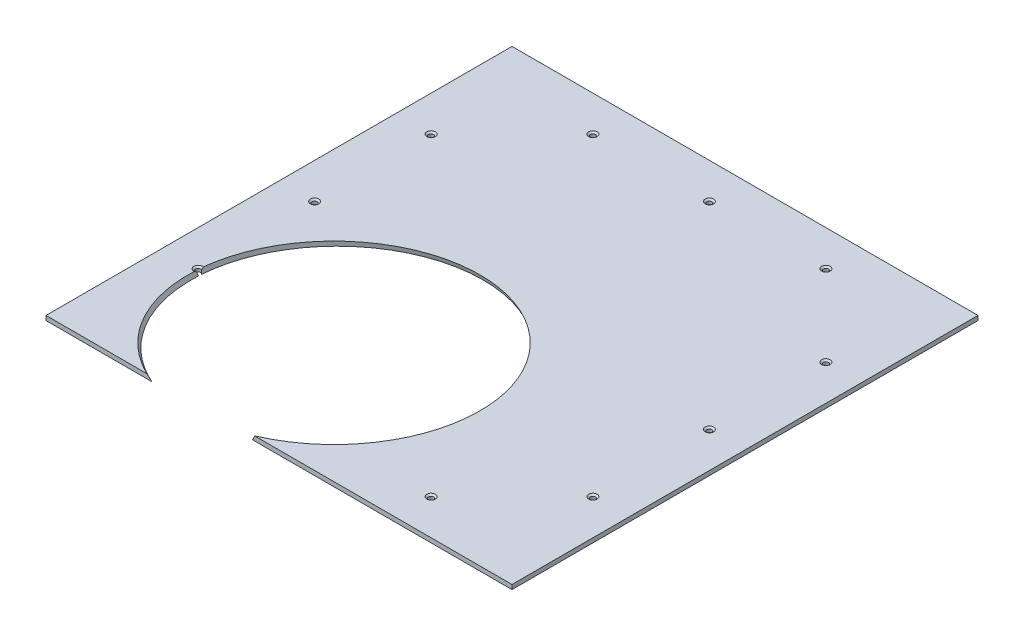
ISO-10303-21;
HEADER;
FILE_DESCRIPTION(('STEP AP214'),'2;1');
FILE_NAME('part.step','',(''),(''),'','','');
FILE_SCHEMA(('AUTOMOTIVE_DESIGN { 1 0 10303 214 1 1 1 1 }'));
ENDSEC;
DATA;
#1=APPLICATION_CONTEXT('core data for automotive mechanical design processes');
#2=APPLICATION_PROTOCOL_DEFINITION('international standard','automotive_design',2000,#1);
#3=PRODUCT_CONTEXT('',#1,'mechanical');
#4=PRODUCT('Part','Part','',(#3));
#5=PRODUCT_RELATED_PRODUCT_CATEGORY('part','',(#4));
#6=PRODUCT_DEFINITION_FORMATION('','',#4);
#7=PRODUCT_DEFINITION_CONTEXT('part definition',#1,'design');
#8=PRODUCT_DEFINITION('design','',#6,#7);
#9=PRODUCT_DEFINITION_SHAPE('','',#8);
#10=(LENGTH_UNIT() NAMED_UNIT(*) SI_UNIT(.MILLI.,.METRE.));
#11=(NAMED_UNIT(*) PLANE_ANGLE_UNIT() SI_UNIT($,.RADIAN.));
#12=(NAMED_UNIT(*) SI_UNIT($,.STERADIAN.) SOLID_ANGLE_UNIT());
#13=UNCERTAINTY_MEASURE_WITH_UNIT(LENGTH_MEASURE(1.E-05),#10,'distance_accuracy_value','');
#14=(GEOMETRIC_REPRESENTATION_CONTEXT(3) GLOBAL_UNCERTAINTY_ASSIGNED_CONTEXT((#13)) GLOBAL_UNIT_ASSIGNED_CONTEXT((#10,
#11,#12)) REPRESENTATION_CONTEXT('',''));
#15=CARTESIAN_POINT('',(0.,0.,0.));
#16=DIRECTION('',(0.,0.,1.));
#17=DIRECTION('',(1.,0.,0.));
#18=AXIS2_PLACEMENT_3D('',#15,#16,#17);
#19=CARTESIAN_POINT('',(83.101307,94.213807,83.101307));
#20=DIRECTION('',(0.,0.,1.));
#21=DIRECTION('',(-1.,0.,0.));
#22=AXIS2_PLACEMENT_3D('',#19,#20,#21);
#23=PLANE('',#22);
#24=CARTESIAN_POINT('',(-66.007660680962,217.846089201799,83.101307));
#25=DIRECTION('',(0.,0.,1.));
#26=DIRECTION('',(-0.326618295539672,0.945156330465368,0.));
#27=AXIS2_PLACEMENT_3D('',#24,#25,#26);
#28=ELLIPSE('',#27,142.645185752416,44.45);
#29=CARTESIAN_POINT('',(-47.0825286941283,94.213807,83.101307));
#30=VERTEX_POINT('',#29);
#31=CARTESIAN_POINT('',(-45.3284884922629,92.626307,83.101307));
#32=VERTEX_POINT('',#31);
#33=EDGE_CURVE('E127',#30,#32,#28,.T.);
#34=ORIENTED_EDGE('',*,*,#33,.F.);
#35=DIRECTION('',(-1.,0.,0.));
#36=VECTOR('',#35,1.);
#37=CARTESIAN_POINT('',(83.101307,94.213807,83.101307));
#38=LINE('',#37,#36);
#39=CARTESIAN_POINT('',(-83.101307,94.213807,83.101307));
#40=VERTEX_POINT('',#39);
#41=EDGE_CURVE('E215',#30,#40,#38,.T.);
#42=ORIENTED_EDGE('',*,*,#41,.T.);
#43=DIRECTION('',(0.,-1.,0.));
#44=VECTOR('',#43,1.);
#45=CARTESIAN_POINT('',(-83.101307,94.213807,83.101307));
#46=LINE('',#45,#44);
#47=CARTESIAN_POINT('',(-83.101307,92.626307,83.101307));
#48=VERTEX_POINT('',#47);
#49=EDGE_CURVE('E241',#40,#48,#46,.T.);
#50=ORIENTED_EDGE('',*,*,#49,.T.);
#51=DIRECTION('',(-1.,0.,0.));
#52=VECTOR('',#51,1.);
#53=CARTESIAN_POINT('',(83.101307,92.626307,83.101307));
#54=LINE('',#53,#52);
#55=EDGE_CURVE('E229',#32,#48,#54,.T.);
#56=ORIENTED_EDGE('',*,*,#55,.F.);
#57=EDGE_LOOP('',(#34,#42,#50,#56));
#58=FACE_BOUND('',#57,.T.);
#59=ADVANCED_FACE('F32',(#58),#23,.T.);
#60=CARTESIAN_POINT('',(83.101307,94.213807,83.101307));
#61=DIRECTION('',(1.,0.,0.));
#62=DIRECTION('',(0.,0.,1.));
#63=AXIS2_PLACEMENT_3D('',#60,#61,#62);
#64=PLANE('',#63);
#65=DIRECTION('',(0.,0.,1.));
#66=VECTOR('',#65,1.);
#67=CARTESIAN_POINT('',(83.101307,92.626307,83.101307));
#68=LINE('',#67,#66);
#69=CARTESIAN_POINT('',(83.101307,92.626307,-83.101307));
#70=VERTEX_POINT('',#69);
#71=CARTESIAN_POINT('',(83.101307,92.626307,83.101307));
#72=VERTEX_POINT('',#71);
#73=EDGE_CURVE('E211',#70,#72,#68,.T.);
#74=ORIENTED_EDGE('',*,*,#73,.F.);
#75=DIRECTION('',(0.,-1.,0.));
#76=VECTOR('',#75,1.);
#77=CARTESIAN_POINT('',(83.101307,94.213807,-83.101307));
#78=LINE('',#77,#76);
#79=CARTESIAN_POINT('',(83.101307,94.213807,-83.101307));
#80=VERTEX_POINT('',#79);
#81=EDGE_CURVE('E112',#80,#70,#78,.T.);
#82=ORIENTED_EDGE('',*,*,#81,.F.);
#83=DIRECTION('',(0.,0.,1.));
#84=VECTOR('',#83,1.);
#85=CARTESIAN_POINT('',(83.101307,94.213807,83.101307));
#86=LINE('',#85,#84);
#87=CARTESIAN_POINT('',(83.101307,94.213807,83.101307));
#88=VERTEX_POINT('',#87);
#89=EDGE_CURVE('E212',#80,#88,#86,.T.);
#90=ORIENTED_EDGE('',*,*,#89,.T.);
#91=DIRECTION('',(0.,-1.,0.));
#92=VECTOR('',#91,1.);
#93=CARTESIAN_POINT('',(83.101307,94.213807,83.101307));
#94=LINE('',#93,#92);
#95=EDGE_CURVE('E226',#88,#72,#94,.T.);
#96=ORIENTED_EDGE('',*,*,#95,.T.);
#97=EDGE_LOOP('',(#74,#82,#90,#96));
#98=FACE_BOUND('',#97,.T.);
#99=ADVANCED_FACE('F34',(#98),#64,.T.);
#100=CARTESIAN_POINT('',(83.101307,94.213807,-83.101307));
#101=DIRECTION('',(0.,0.,-1.));
#102=DIRECTION('',(1.,0.,0.));
#103=AXIS2_PLACEMENT_3D('',#100,#101,#102);
#104=PLANE('',#103);
#105=DIRECTION('',(1.,0.,0.));
#106=VECTOR('',#105,1.);
#107=CARTESIAN_POINT('',(83.101307,92.626307,-83.101307));
#108=LINE('',#107,#106);
#109=CARTESIAN_POINT('',(-83.101307,92.626307,-83.101307));
#110=VERTEX_POINT('',#109);
#111=EDGE_CURVE('E216',#110,#70,#108,.T.);
#112=ORIENTED_EDGE('',*,*,#111,.F.);
#113=DIRECTION('',(0.,-1.,0.));
#114=VECTOR('',#113,1.);
#115=CARTESIAN_POINT('',(-83.101307,94.213807,-83.101307));
#116=LINE('',#115,#114);
#117=CARTESIAN_POINT('',(-83.101307,94.213807,-83.101307));
#118=VERTEX_POINT('',#117);
#119=EDGE_CURVE('E239',#118,#110,#116,.T.);
#120=ORIENTED_EDGE('',*,*,#119,.F.);
#121=DIRECTION('',(1.,0.,0.));
#122=VECTOR('',#121,1.);
#123=CARTESIAN_POINT('',(83.101307,94.213807,-83.101307));
#124=LINE('',#123,#122);
#125=EDGE_CURVE('E223',#118,#80,#124,.T.);
#126=ORIENTED_EDGE('',*,*,#125,.T.);
#127=ORIENTED_EDGE('',*,*,#81,.T.);
#128=EDGE_LOOP('',(#112,#120,#126,#127));
#129=FACE_BOUND('',#128,.T.);
#130=ADVANCED_FACE('F289',(#129),#104,.T.);
#131=CARTESIAN_POINT('',(-83.101307,94.213807,83.101307));
#132=DIRECTION('',(-1.,0.,0.));
#133=DIRECTION('',(0.,0.,-1.));
#134=AXIS2_PLACEMENT_3D('',#131,#132,#133);
#135=PLANE('',#134);
#136=DIRECTION('',(0.,0.,-1.));
#137=VECTOR('',#136,1.);
#138=CARTESIAN_POINT('',(-83.101307,92.626307,83.101307));
#139=LINE('',#138,#137);
#140=EDGE_CURVE('E233',#48,#110,#139,.T.);
#141=ORIENTED_EDGE('',*,*,#140,.F.);
#142=ORIENTED_EDGE('',*,*,#49,.F.);
#143=DIRECTION('',(0.,0.,-1.));
#144=VECTOR('',#143,1.);
#145=CARTESIAN_POINT('',(-83.101307,94.213807,83.101307));
#146=LINE('',#145,#144);
#147=EDGE_CURVE('E220',#40,#118,#146,.T.);
#148=ORIENTED_EDGE('',*,*,#147,.T.);
#149=ORIENTED_EDGE('',*,*,#119,.T.);
#150=EDGE_LOOP('',(#141,#142,#148,#149));
#151=FACE_BOUND('',#150,.T.);
#152=ADVANCED_FACE('F286',(#151),#135,.T.);
#153=CARTESIAN_POINT('',(-9.44166394168704,92.626307,83.101307));
#154=VERTEX_POINT('',#153);
#155=CARTESIAN_POINT('',(-8.6669155379461,94.213807,83.101307));
#156=VERTEX_POINT('',#155);
#157=EDGE_CURVE('E271',#154,#156,#28,.T.);
#158=ORIENTED_EDGE('',*,*,#157,.F.);
#159=EDGE_CURVE('E230',#72,#154,#54,.T.);
#160=ORIENTED_EDGE('',*,*,#159,.F.);
#161=ORIENTED_EDGE('',*,*,#95,.F.);
#162=EDGE_CURVE('E217',#88,#156,#38,.T.);
#163=ORIENTED_EDGE('',*,*,#162,.T.);
#164=EDGE_LOOP('',(#158,#160,#161,#163));
#165=FACE_BOUND('',#164,.T.);
#166=ADVANCED_FACE('F297',(#165),#23,.T.);
#167=CARTESIAN_POINT('',(83.101307,94.213807,-83.101307));
#168=DIRECTION('',(0.,1.,0.));
#169=DIRECTION('',(0.,0.,-1.));
#170=AXIS2_PLACEMENT_3D('',#167,#168,#169);
#171=PLANE('',#170);
#172=CARTESIAN_POINT('',(-23.2839715040096,94.213807,40.2046350415651));
#173=DIRECTION('',(0.,1.,0.));
#174=DIRECTION('',(-0.705676740389854,0.,0.708533935724147));
#175=AXIS2_PLACEMENT_3D('',#172,#173,#174);
#176=ELLIPSE('',#175,49.4935758743306,44.45);
#177=CARTESIAN_POINT('',(-70.030023915099,94.213807,40.0856700322202));
#178=VERTEX_POINT('',#177);
#179=EDGE_CURVE('E52',#156,#178,#176,.T.);
#180=ORIENTED_EDGE('',*,*,#179,.F.);
#181=ORIENTED_EDGE('',*,*,#162,.F.);
#182=ORIENTED_EDGE('',*,*,#89,.F.);
#183=ORIENTED_EDGE('',*,*,#125,.F.);
#184=ORIENTED_EDGE('',*,*,#147,.F.);
#185=ORIENTED_EDGE('',*,*,#41,.F.);
#186=CARTESIAN_POINT('',(-70.2620861199085,94.2138069999999,43.05552732745));
#187=VERTEX_POINT('',#186);
#188=EDGE_CURVE('E272',#187,#30,#176,.T.);
#189=ORIENTED_EDGE('',*,*,#188,.F.);
#190=CARTESIAN_POINT('',(-70.4013070000004,94.213807,41.5506534999993));
#191=DIRECTION('',(0.,1.,0.));
#192=DIRECTION('',(0.,0.,-1.));
#193=AXIS2_PLACEMENT_3D('',#190,#191,#192);
#194=CIRCLE('',#193,1.51130000000001);
#195=EDGE_CURVE('E123',#178,#187,#194,.T.);
#196=ORIENTED_EDGE('',*,*,#195,.F.);
#197=EDGE_LOOP('',(#180,#181,#182,#183,#184,#185,#189,#196));
#198=FACE_BOUND('',#197,.T.);
#199=CARTESIAN_POINT('',(-70.401307,94.213807,-7.26677097100821E-13));
#200=DIRECTION('',(0.,1.,0.));
#201=DIRECTION('',(0.,0.,-1.));
#202=AXIS2_PLACEMENT_3D('',#199,#200,#201);
#203=CIRCLE('',#202,1.51129999999999);
#204=CARTESIAN_POINT('',(-70.401307,94.213807,-1.51130000000072));
#205=VERTEX_POINT('',#204);
#206=EDGE_CURVE('E125',#205,#205,#203,.T.);
#207=ORIENTED_EDGE('',*,*,#206,.F.);
#208=EDGE_LOOP('',(#207));
#209=FACE_BOUND('',#208,.T.);
#210=CARTESIAN_POINT('',(-70.4013069999996,94.213807,-41.5506535000007));
#211=DIRECTION('',(0.,1.,0.));
#212=DIRECTION('',(0.,0.,-1.));
#213=AXIS2_PLACEMENT_3D('',#210,#211,#212);
#214=CIRCLE('',#213,1.51129999999999);
#215=CARTESIAN_POINT('',(-70.4013069999996,94.213807,-43.0619535000007));
#216=VERTEX_POINT('',#215);
#217=EDGE_CURVE('E139',#216,#216,#214,.T.);
#218=ORIENTED_EDGE('',*,*,#217,.F.);
#219=EDGE_LOOP('',(#218));
#220=FACE_BOUND('',#219,.T.);
#221=CARTESIAN_POINT('',(41.5506534999995,94.213807,70.4013070000003));
#222=DIRECTION('',(0.,1.,0.));
#223=DIRECTION('',(0.,0.,-1.));
#224=AXIS2_PLACEMENT_3D('',#221,#222,#223);
#225=CIRCLE('',#224,1.5113);
#226=CARTESIAN_POINT('',(41.5506534999995,94.213807,68.8900070000003));
#227=VERTEX_POINT('',#226);
#228=EDGE_CURVE('E148',#227,#227,#225,.T.);
#229=ORIENTED_EDGE('',*,*,#228,.F.);
#230=EDGE_LOOP('',(#229));
#231=FACE_BOUND('',#230,.T.);
#232=CARTESIAN_POINT('',(70.4013070000001,94.213807,-41.5506534999998));
#233=DIRECTION('',(0.,1.,0.));
#234=DIRECTION('',(0.,0.,-1.));
#235=AXIS2_PLACEMENT_3D('',#232,#233,#234);
#236=CIRCLE('',#235,1.51129999999999);
#237=CARTESIAN_POINT('',(70.4013070000001,94.213807,-43.0619534999998));
#238=VERTEX_POINT('',#237);
#239=EDGE_CURVE('E157',#238,#238,#236,.T.);
#240=ORIENTED_EDGE('',*,*,#239,.F.);
#241=EDGE_LOOP('',(#240));
#242=FACE_BOUND('',#241,.T.);
#243=CARTESIAN_POINT('',(70.401307,94.213807,2.35067113119114E-13));
#244=DIRECTION('',(0.,1.,0.));
#245=DIRECTION('',(0.,0.,-1.));
#246=AXIS2_PLACEMENT_3D('',#243,#244,#245);
#247=CIRCLE('',#246,1.51129999999999);
#248=CARTESIAN_POINT('',(70.401307,94.213807,-1.51129999999976));
#249=VERTEX_POINT('',#248);
#250=EDGE_CURVE('E166',#249,#249,#247,.T.);
#251=ORIENTED_EDGE('',*,*,#250,.F.);
#252=EDGE_LOOP('',(#251));
#253=FACE_BOUND('',#252,.T.);
#254=CARTESIAN_POINT('',(70.4013069999999,94.213807,41.5506535000003));
#255=DIRECTION('',(0.,1.,0.));
#256=DIRECTION('',(0.,0.,-1.));
#257=AXIS2_PLACEMENT_3D('',#254,#255,#256);
#258=CIRCLE('',#257,1.51130000000001);
#259=CARTESIAN_POINT('',(70.4013069999999,94.213807,40.0393535000002));
#260=VERTEX_POINT('',#259);
#261=EDGE_CURVE('E175',#260,#260,#258,.T.);
#262=ORIENTED_EDGE('',*,*,#261,.F.);
#263=EDGE_LOOP('',(#262));
#264=FACE_BOUND('',#263,.T.);
#265=CARTESIAN_POINT('',(-41.5506535,94.213807,-70.401307));
#266=DIRECTION('',(0.,1.,0.));
#267=DIRECTION('',(0.,0.,-1.));
#268=AXIS2_PLACEMENT_3D('',#265,#266,#267);
#269=CIRCLE('',#268,1.5113);
#270=CARTESIAN_POINT('',(-41.5506535,94.213807,-71.912607));
#271=VERTEX_POINT('',#270);
#272=EDGE_CURVE('E184',#271,#271,#269,.T.);
#273=ORIENTED_EDGE('',*,*,#272,.F.);
#274=EDGE_LOOP('',(#273));
#275=FACE_BOUND('',#274,.T.);
#276=CARTESIAN_POINT('',(0.,94.213807,-70.401307));
#277=DIRECTION('',(0.,1.,0.));
#278=DIRECTION('',(0.,0.,-1.));
#279=AXIS2_PLACEMENT_3D('',#276,#277,#278);
#280=CIRCLE('',#279,1.5113);
#281=CARTESIAN_POINT('',(0.,94.213807,-71.912607));
#282=VERTEX_POINT('',#281);
#283=EDGE_CURVE('E193',#282,#282,#280,.T.);
#284=ORIENTED_EDGE('',*,*,#283,.F.);
#285=EDGE_LOOP('',(#284));
#286=FACE_BOUND('',#285,.T.);
#287=CARTESIAN_POINT('',(41.5506535,94.213807,-70.401307));
#288=DIRECTION('',(0.,1.,0.));
#289=DIRECTION('',(0.,0.,-1.));
#290=AXIS2_PLACEMENT_3D('',#287,#288,#289);
#291=CIRCLE('',#290,1.5113);
#292=CARTESIAN_POINT('',(41.5506535,94.213807,-71.912607));
#293=VERTEX_POINT('',#292);
#294=EDGE_CURVE('E202',#293,#293,#291,.T.);
#295=ORIENTED_EDGE('',*,*,#294,.F.);
#296=EDGE_LOOP('',(#295));
#297=FACE_BOUND('',#296,.T.);
#298=ADVANCED_FACE('F300',(#198,#209,#220,#231,#242,#253,#264,#275,#286,#297),#171,.T.);
#299=CARTESIAN_POINT('',(83.101307,92.626307,-83.101307));
#300=DIRECTION('',(0.,1.,0.));
#301=DIRECTION('',(0.,0.,-1.));
#302=AXIS2_PLACEMENT_3D('',#299,#300,#301);
#303=PLANE('',#302);
#304=ORIENTED_EDGE('',*,*,#159,.T.);
#305=CARTESIAN_POINT('',(-22.7353780835816,92.626307,39.6538204361786));
#306=DIRECTION('',(0.,1.,0.));
#307=DIRECTION('',(-0.705676740389854,0.,0.708533935724147));
#308=AXIS2_PLACEMENT_3D('',#305,#306,#307);
#309=ELLIPSE('',#308,49.4935758743306,44.45);
#310=CARTESIAN_POINT('',(-69.6279212997942,92.626307,41.1122523609537));
#311=VERTEX_POINT('',#310);
#312=EDGE_CURVE('E120',#154,#311,#309,.T.);
#313=ORIENTED_EDGE('',*,*,#312,.T.);
#314=CARTESIAN_POINT('',(-70.4013070000004,92.626307,41.5506534999993));
#315=DIRECTION('',(0.,1.,0.));
#316=DIRECTION('',(0.,0.,-1.));
#317=AXIS2_PLACEMENT_3D('',#314,#315,#316);
#318=CIRCLE('',#317,0.889000000000001);
#319=CARTESIAN_POINT('',(-69.6921231555642,92.626307,42.0867311760787));
#320=VERTEX_POINT('',#319);
#321=EDGE_CURVE('E119',#311,#320,#318,.T.);
#322=ORIENTED_EDGE('',*,*,#321,.T.);
#323=EDGE_CURVE('E270',#320,#32,#309,.T.);
#324=ORIENTED_EDGE('',*,*,#323,.T.);
#325=ORIENTED_EDGE('',*,*,#55,.T.);
#326=ORIENTED_EDGE('',*,*,#140,.T.);
#327=ORIENTED_EDGE('',*,*,#111,.T.);
#328=ORIENTED_EDGE('',*,*,#73,.T.);
#329=EDGE_LOOP('',(#304,#313,#322,#324,#325,#326,#327,#328));
#330=FACE_BOUND('',#329,.T.);
#331=CARTESIAN_POINT('',(-70.401307,92.626307,-7.26677097100821E-13));
#332=DIRECTION('',(0.,1.,0.));
#333=DIRECTION('',(0.,0.,-1.));
#334=AXIS2_PLACEMENT_3D('',#331,#332,#333);
#335=CIRCLE('',#334,0.889000000000001);
#336=CARTESIAN_POINT('',(-70.401307,92.626307,-0.889000000000728));
#337=VERTEX_POINT('',#336);
#338=EDGE_CURVE('E136',#337,#337,#335,.T.);
#339=ORIENTED_EDGE('',*,*,#338,.T.);
#340=EDGE_LOOP('',(#339));
#341=FACE_BOUND('',#340,.T.);
#342=CARTESIAN_POINT('',(-70.4013069999996,92.626307,-41.5506535000007));
#343=DIRECTION('',(0.,1.,0.));
#344=DIRECTION('',(0.,0.,-1.));
#345=AXIS2_PLACEMENT_3D('',#342,#343,#344);
#346=CIRCLE('',#345,0.889000000000001);
#347=CARTESIAN_POINT('',(-70.4013069999996,92.626307,-42.4396535000007));
#348=VERTEX_POINT('',#347);
#349=EDGE_CURVE('E145',#348,#348,#346,.T.);
#350=ORIENTED_EDGE('',*,*,#349,.T.);
#351=EDGE_LOOP('',(#350));
#352=FACE_BOUND('',#351,.T.);
#353=CARTESIAN_POINT('',(41.5506534999995,92.626307,70.4013070000003));
#354=DIRECTION('',(0.,1.,0.));
#355=DIRECTION('',(0.,0.,-1.));
#356=AXIS2_PLACEMENT_3D('',#353,#354,#355);
#357=CIRCLE('',#356,0.889000000000001);
#358=CARTESIAN_POINT('',(41.5506534999995,92.626307,69.5123070000003));
#359=VERTEX_POINT('',#358);
#360=EDGE_CURVE('E154',#359,#359,#357,.T.);
#361=ORIENTED_EDGE('',*,*,#360,.T.);
#362=EDGE_LOOP('',(#361));
#363=FACE_BOUND('',#362,.T.);
#364=CARTESIAN_POINT('',(70.4013070000001,92.626307,-41.5506534999998));
#365=DIRECTION('',(0.,1.,0.));
#366=DIRECTION('',(0.,0.,-1.));
#367=AXIS2_PLACEMENT_3D('',#364,#365,#366);
#368=CIRCLE('',#367,0.889000000000001);
#369=CARTESIAN_POINT('',(70.4013070000001,92.626307,-42.4396534999998));
#370=VERTEX_POINT('',#369);
#371=EDGE_CURVE('E163',#370,#370,#368,.T.);
#372=ORIENTED_EDGE('',*,*,#371,.T.);
#373=EDGE_LOOP('',(#372));
#374=FACE_BOUND('',#373,.T.);
#375=CARTESIAN_POINT('',(70.401307,92.626307,2.35067113119114E-13));
#376=DIRECTION('',(0.,1.,0.));
#377=DIRECTION('',(0.,0.,-1.));
#378=AXIS2_PLACEMENT_3D('',#375,#376,#377);
#379=CIRCLE('',#378,0.889000000000001);
#380=CARTESIAN_POINT('',(70.401307,92.626307,-0.888999999999766));
#381=VERTEX_POINT('',#380);
#382=EDGE_CURVE('E172',#381,#381,#379,.T.);
#383=ORIENTED_EDGE('',*,*,#382,.T.);
#384=EDGE_LOOP('',(#383));
#385=FACE_BOUND('',#384,.T.);
#386=CARTESIAN_POINT('',(70.4013069999999,92.626307,41.5506535000003));
#387=DIRECTION('',(0.,1.,0.));
#388=DIRECTION('',(0.,0.,-1.));
#389=AXIS2_PLACEMENT_3D('',#386,#387,#388);
#390=CIRCLE('',#389,0.889000000000001);
#391=CARTESIAN_POINT('',(70.4013069999999,92.626307,40.6616535000002));
#392=VERTEX_POINT('',#391);
#393=EDGE_CURVE('E181',#392,#392,#390,.T.);
#394=ORIENTED_EDGE('',*,*,#393,.T.);
#395=EDGE_LOOP('',(#394));
#396=FACE_BOUND('',#395,.T.);
#397=CARTESIAN_POINT('',(-41.5506535,92.626307,-70.401307));
#398=DIRECTION('',(0.,1.,0.));
#399=DIRECTION('',(0.,0.,-1.));
#400=AXIS2_PLACEMENT_3D('',#397,#398,#399);
#401=CIRCLE('',#400,0.889000000000001);
#402=CARTESIAN_POINT('',(-41.5506535,92.626307,-71.290307));
#403=VERTEX_POINT('',#402);
#404=EDGE_CURVE('E190',#403,#403,#401,.T.);
#405=ORIENTED_EDGE('',*,*,#404,.T.);
#406=EDGE_LOOP('',(#405));
#407=FACE_BOUND('',#406,.T.);
#408=CARTESIAN_POINT('',(0.,92.626307,-70.401307));
#409=DIRECTION('',(0.,1.,0.));
#410=DIRECTION('',(0.,0.,-1.));
#411=AXIS2_PLACEMENT_3D('',#408,#409,#410);
#412=CIRCLE('',#411,0.889);
#413=CARTESIAN_POINT('',(0.,92.626307,-71.290307));
#414=VERTEX_POINT('',#413);
#415=EDGE_CURVE('E199',#414,#414,#412,.T.);
#416=ORIENTED_EDGE('',*,*,#415,.T.);
#417=EDGE_LOOP('',(#416));
#418=FACE_BOUND('',#417,.T.);
#419=CARTESIAN_POINT('',(41.5506535,92.626307,-70.401307));
#420=DIRECTION('',(0.,1.,0.));
#421=DIRECTION('',(0.,0.,-1.));
#422=AXIS2_PLACEMENT_3D('',#419,#420,#421);
#423=CIRCLE('',#422,0.889000000000001);
#424=CARTESIAN_POINT('',(41.5506535,92.626307,-71.290307));
#425=VERTEX_POINT('',#424);
#426=EDGE_CURVE('E208',#425,#425,#423,.T.);
#427=ORIENTED_EDGE('',*,*,#426,.T.);
#428=EDGE_LOOP('',(#427));
#429=FACE_BOUND('',#428,.T.);
#430=ADVANCED_FACE('F278',(#330,#341,#352,#363,#374,#385,#396,#407,#418,#429),#303,.F.);
#431=CARTESIAN_POINT('',(41.5506535,94.213807,-70.401307));
#432=DIRECTION('',(0.,1.,0.));
#433=DIRECTION('',(0.,0.,-1.));
#434=AXIS2_PLACEMENT_3D('',#431,#432,#433);
#435=CYLINDRICAL_SURFACE('',#434,0.888999999999997);
#436=ORIENTED_EDGE('',*,*,#426,.F.);
#437=EDGE_LOOP('',(#436));
#438=FACE_BOUND('',#437,.T.);
#439=CARTESIAN_POINT('',(41.5506535,93.6916352995184,-70.401307));
#440=DIRECTION('',(0.,1.,0.));
#441=DIRECTION('',(0.,0.,-1.));
#442=AXIS2_PLACEMENT_3D('',#439,#440,#441);
#443=CIRCLE('',#442,0.888999999999994);
#444=CARTESIAN_POINT('',(41.5506535,93.6916352995184,-71.290307));
#445=VERTEX_POINT('',#444);
#446=EDGE_CURVE('E205',#445,#445,#443,.T.);
#447=ORIENTED_EDGE('',*,*,#446,.T.);
#448=EDGE_LOOP('',(#447));
#449=FACE_BOUND('',#448,.T.);
#450=ADVANCED_FACE('F325',(#438,#449),#435,.F.);
#451=CARTESIAN_POINT('',(41.5506535,94.213807,-70.401307));
#452=DIRECTION('',(0.,1.,0.));
#453=DIRECTION('',(0.,0.,-1.));
#454=AXIS2_PLACEMENT_3D('',#451,#452,#453);
#455=CONICAL_SURFACE('',#454,1.5113,0.872664625997172);
#456=ORIENTED_EDGE('',*,*,#446,.F.);
#457=EDGE_LOOP('',(#456));
#458=FACE_BOUND('',#457,.T.);
#459=ORIENTED_EDGE('',*,*,#294,.T.);
#460=EDGE_LOOP('',(#459));
#461=FACE_BOUND('',#460,.T.);
#462=ADVANCED_FACE('F322',(#458,#461),#455,.F.);
#463=CARTESIAN_POINT('',(0.,94.213807,-70.401307));
#464=DIRECTION('',(0.,1.,0.));
#465=DIRECTION('',(0.,0.,-1.));
#466=AXIS2_PLACEMENT_3D('',#463,#464,#465);
#467=CYLINDRICAL_SURFACE('',#466,0.888999999999998);
#468=ORIENTED_EDGE('',*,*,#415,.F.);
#469=EDGE_LOOP('',(#468));
#470=FACE_BOUND('',#469,.T.);
#471=CARTESIAN_POINT('',(0.,93.6916352995184,-70.401307));
#472=DIRECTION('',(0.,1.,0.));
#473=DIRECTION('',(0.,0.,-1.));
#474=AXIS2_PLACEMENT_3D('',#471,#472,#473);
#475=CIRCLE('',#474,0.888999999999997);
#476=CARTESIAN_POINT('',(0.,93.6916352995184,-71.290307));
#477=VERTEX_POINT('',#476);
#478=EDGE_CURVE('E196',#477,#477,#475,.T.);
#479=ORIENTED_EDGE('',*,*,#478,.T.);
#480=EDGE_LOOP('',(#479));
#481=FACE_BOUND('',#480,.T.);
#482=ADVANCED_FACE('F324',(#470,#481),#467,.F.);
#483=CARTESIAN_POINT('',(0.,94.213807,-70.401307));
#484=DIRECTION('',(0.,1.,0.));
#485=DIRECTION('',(0.,0.,-1.));
#486=AXIS2_PLACEMENT_3D('',#483,#484,#485);
#487=CONICAL_SURFACE('',#486,1.5113,0.87266462599717);
#488=ORIENTED_EDGE('',*,*,#478,.F.);
#489=EDGE_LOOP('',(#488));
#490=FACE_BOUND('',#489,.T.);
#491=ORIENTED_EDGE('',*,*,#283,.T.);
#492=EDGE_LOOP('',(#491));
#493=FACE_BOUND('',#492,.T.);
#494=ADVANCED_FACE('F332',(#490,#493),#487,.F.);
#495=CARTESIAN_POINT('',(-41.5506535,94.213807,-70.401307));
#496=DIRECTION('',(0.,1.,0.));
#497=DIRECTION('',(0.,0.,-1.));
#498=AXIS2_PLACEMENT_3D('',#495,#496,#497);
#499=CYLINDRICAL_SURFACE('',#498,0.888999999999997);
#500=ORIENTED_EDGE('',*,*,#404,.F.);
#501=EDGE_LOOP('',(#500));
#502=FACE_BOUND('',#501,.T.);
#503=CARTESIAN_POINT('',(-41.5506535,93.6916352995184,-70.401307));
#504=DIRECTION('',(0.,1.,0.));
#505=DIRECTION('',(0.,0.,-1.));
#506=AXIS2_PLACEMENT_3D('',#503,#504,#505);
#507=CIRCLE('',#506,0.888999999999994);
#508=CARTESIAN_POINT('',(-41.5506535,93.6916352995184,-71.290307));
#509=VERTEX_POINT('',#508);
#510=EDGE_CURVE('E187',#509,#509,#507,.T.);
#511=ORIENTED_EDGE('',*,*,#510,.T.);
#512=EDGE_LOOP('',(#511));
#513=FACE_BOUND('',#512,.T.);
#514=ADVANCED_FACE('F384',(#502,#513),#499,.F.);
#515=CARTESIAN_POINT('',(-41.5506535,94.213807,-70.401307));
#516=DIRECTION('',(0.,1.,0.));
#517=DIRECTION('',(0.,0.,-1.));
#518=AXIS2_PLACEMENT_3D('',#515,#516,#517);
#519=CONICAL_SURFACE('',#518,1.5113,0.872664625997172);
#520=ORIENTED_EDGE('',*,*,#510,.F.);
#521=EDGE_LOOP('',(#520));
#522=FACE_BOUND('',#521,.T.);
#523=ORIENTED_EDGE('',*,*,#272,.T.);
#524=EDGE_LOOP('',(#523));
#525=FACE_BOUND('',#524,.T.);
#526=ADVANCED_FACE('F394',(#522,#525),#519,.F.);
#527=CARTESIAN_POINT('',(70.4013069999999,94.213807,41.5506535000003));
#528=DIRECTION('',(0.,1.,0.));
#529=DIRECTION('',(0.,0.,-1.));
#530=AXIS2_PLACEMENT_3D('',#527,#528,#529);
#531=CYLINDRICAL_SURFACE('',#530,0.889000000000001);
#532=ORIENTED_EDGE('',*,*,#393,.F.);
#533=EDGE_LOOP('',(#532));
#534=FACE_BOUND('',#533,.T.);
#535=CARTESIAN_POINT('',(70.4013069999999,93.6916352995184,41.5506535000003));
#536=DIRECTION('',(0.,1.,0.));
#537=DIRECTION('',(0.,0.,-1.));
#538=AXIS2_PLACEMENT_3D('',#535,#536,#537);
#539=CIRCLE('',#538,0.889000000000001);
#540=CARTESIAN_POINT('',(70.4013069999999,93.6916352995184,40.6616535000002));
#541=VERTEX_POINT('',#540);
#542=EDGE_CURVE('E178',#541,#541,#539,.T.);
#543=ORIENTED_EDGE('',*,*,#542,.T.);
#544=EDGE_LOOP('',(#543));
#545=FACE_BOUND('',#544,.T.);
#546=ADVANCED_FACE('F404',(#534,#545),#531,.F.);
#547=CARTESIAN_POINT('',(70.4013069999999,94.213807,41.5506535000003));
#548=DIRECTION('',(0.,1.,0.));
#549=DIRECTION('',(0.,0.,-1.));
#550=AXIS2_PLACEMENT_3D('',#547,#548,#549);
#551=CONICAL_SURFACE('',#550,1.51130000000001,0.872664625997172);
#552=ORIENTED_EDGE('',*,*,#542,.F.);
#553=EDGE_LOOP('',(#552));
#554=FACE_BOUND('',#553,.T.);
#555=ORIENTED_EDGE('',*,*,#261,.T.);
#556=EDGE_LOOP('',(#555));
#557=FACE_BOUND('',#556,.T.);
#558=ADVANCED_FACE('F414',(#554,#557),#551,.F.);
#559=CARTESIAN_POINT('',(70.401307,94.213807,2.35067113119114E-13));
#560=DIRECTION('',(0.,1.,0.));
#561=DIRECTION('',(0.,0.,-1.));
#562=AXIS2_PLACEMENT_3D('',#559,#560,#561);
#563=CYLINDRICAL_SURFACE('',#562,0.889000000000001);
#564=ORIENTED_EDGE('',*,*,#382,.F.);
#565=EDGE_LOOP('',(#564));
#566=FACE_BOUND('',#565,.T.);
#567=CARTESIAN_POINT('',(70.401307,93.6916352995184,2.35067113119114E-13));
#568=DIRECTION('',(0.,1.,0.));
#569=DIRECTION('',(0.,0.,-1.));
#570=AXIS2_PLACEMENT_3D('',#567,#568,#569);
#571=CIRCLE('',#570,0.889000000000001);
#572=CARTESIAN_POINT('',(70.401307,93.6916352995184,-0.888999999999766));
#573=VERTEX_POINT('',#572);
#574=EDGE_CURVE('E169',#573,#573,#571,.T.);
#575=ORIENTED_EDGE('',*,*,#574,.T.);
#576=EDGE_LOOP('',(#575));
#577=FACE_BOUND('',#576,.T.);
#578=ADVANCED_FACE('F424',(#566,#577),#563,.F.);
#579=CARTESIAN_POINT('',(70.401307,94.213807,2.35067113119114E-13));
#580=DIRECTION('',(0.,1.,0.));
#581=DIRECTION('',(0.,0.,-1.));
#582=AXIS2_PLACEMENT_3D('',#579,#580,#581);
#583=CONICAL_SURFACE('',#582,1.51129999999999,0.872664625997161);
#584=ORIENTED_EDGE('',*,*,#574,.F.);
#585=EDGE_LOOP('',(#584));
#586=FACE_BOUND('',#585,.T.);
#587=ORIENTED_EDGE('',*,*,#250,.T.);
#588=EDGE_LOOP('',(#587));
#589=FACE_BOUND('',#588,.T.);
#590=ADVANCED_FACE('F434',(#586,#589),#583,.F.);
#591=CARTESIAN_POINT('',(70.4013070000001,94.213807,-41.5506534999998));
#592=DIRECTION('',(0.,1.,0.));
#593=DIRECTION('',(0.,0.,-1.));
#594=AXIS2_PLACEMENT_3D('',#591,#592,#593);
#595=CYLINDRICAL_SURFACE('',#594,0.889000000000001);
#596=ORIENTED_EDGE('',*,*,#371,.F.);
#597=EDGE_LOOP('',(#596));
#598=FACE_BOUND('',#597,.T.);
#599=CARTESIAN_POINT('',(70.4013070000001,93.6916352995184,-41.5506534999998));
#600=DIRECTION('',(0.,1.,0.));
#601=DIRECTION('',(0.,0.,-1.));
#602=AXIS2_PLACEMENT_3D('',#599,#600,#601);
#603=CIRCLE('',#602,0.889000000000001);
#604=CARTESIAN_POINT('',(70.4013070000001,93.6916352995184,-42.4396534999998));
#605=VERTEX_POINT('',#604);
#606=EDGE_CURVE('E160',#605,#605,#603,.T.);
#607=ORIENTED_EDGE('',*,*,#606,.T.);
#608=EDGE_LOOP('',(#607));
#609=FACE_BOUND('',#608,.T.);
#610=ADVANCED_FACE('F444',(#598,#609),#595,.F.);
#611=CARTESIAN_POINT('',(70.4013070000001,94.213807,-41.5506534999998));
#612=DIRECTION('',(0.,1.,0.));
#613=DIRECTION('',(0.,0.,-1.));
#614=AXIS2_PLACEMENT_3D('',#611,#612,#613);
#615=CONICAL_SURFACE('',#614,1.51129999999999,0.872664625997161);
#616=ORIENTED_EDGE('',*,*,#606,.F.);
#617=EDGE_LOOP('',(#616));
#618=FACE_BOUND('',#617,.T.);
#619=ORIENTED_EDGE('',*,*,#239,.T.);
#620=EDGE_LOOP('',(#619));
#621=FACE_BOUND('',#620,.T.);
#622=ADVANCED_FACE('F454',(#618,#621),#615,.F.);
#623=CARTESIAN_POINT('',(41.5506534999995,94.213807,70.4013070000003));
#624=DIRECTION('',(0.,1.,0.));
#625=DIRECTION('',(0.,0.,-1.));
#626=AXIS2_PLACEMENT_3D('',#623,#624,#625);
#627=CYLINDRICAL_SURFACE('',#626,0.888999999999997);
#628=ORIENTED_EDGE('',*,*,#360,.F.);
#629=EDGE_LOOP('',(#628));
#630=FACE_BOUND('',#629,.T.);
#631=CARTESIAN_POINT('',(41.5506534999995,93.6916352995184,70.4013070000003));
#632=DIRECTION('',(0.,1.,0.));
#633=DIRECTION('',(0.,0.,-1.));
#634=AXIS2_PLACEMENT_3D('',#631,#632,#633);
#635=CIRCLE('',#634,0.888999999999994);
#636=CARTESIAN_POINT('',(41.5506534999995,93.6916352995184,69.5123070000003));
#637=VERTEX_POINT('',#636);
#638=EDGE_CURVE('E151',#637,#637,#635,.T.);
#639=ORIENTED_EDGE('',*,*,#638,.T.);
#640=EDGE_LOOP('',(#639));
#641=FACE_BOUND('',#640,.T.);
#642=ADVANCED_FACE('F464',(#630,#641),#627,.F.);
#643=CARTESIAN_POINT('',(41.5506534999995,94.213807,70.4013070000003));
#644=DIRECTION('',(0.,1.,0.));
#645=DIRECTION('',(0.,0.,-1.));
#646=AXIS2_PLACEMENT_3D('',#643,#644,#645);
#647=CONICAL_SURFACE('',#646,1.5113,0.872664625997172);
#648=ORIENTED_EDGE('',*,*,#638,.F.);
#649=EDGE_LOOP('',(#648));
#650=FACE_BOUND('',#649,.T.);
#651=ORIENTED_EDGE('',*,*,#228,.T.);
#652=EDGE_LOOP('',(#651));
#653=FACE_BOUND('',#652,.T.);
#654=ADVANCED_FACE('F474',(#650,#653),#647,.F.);
#655=CARTESIAN_POINT('',(-70.4013069999996,94.213807,-41.5506535000007));
#656=DIRECTION('',(0.,1.,0.));
#657=DIRECTION('',(0.,0.,-1.));
#658=AXIS2_PLACEMENT_3D('',#655,#656,#657);
#659=CYLINDRICAL_SURFACE('',#658,0.889000000000001);
#660=ORIENTED_EDGE('',*,*,#349,.F.);
#661=EDGE_LOOP('',(#660));
#662=FACE_BOUND('',#661,.T.);
#663=CARTESIAN_POINT('',(-70.4013069999996,93.6916352995184,-41.5506535000007));
#664=DIRECTION('',(0.,1.,0.));
#665=DIRECTION('',(0.,0.,-1.));
#666=AXIS2_PLACEMENT_3D('',#663,#664,#665);
#667=CIRCLE('',#666,0.889000000000001);
#668=CARTESIAN_POINT('',(-70.4013069999996,93.6916352995184,-42.4396535000007));
#669=VERTEX_POINT('',#668);
#670=EDGE_CURVE('E142',#669,#669,#667,.T.);
#671=ORIENTED_EDGE('',*,*,#670,.T.);
#672=EDGE_LOOP('',(#671));
#673=FACE_BOUND('',#672,.T.);
#674=ADVANCED_FACE('F484',(#662,#673),#659,.F.);
#675=CARTESIAN_POINT('',(-70.4013069999996,94.213807,-41.5506535000007));
#676=DIRECTION('',(0.,1.,0.));
#677=DIRECTION('',(0.,0.,-1.));
#678=AXIS2_PLACEMENT_3D('',#675,#676,#677);
#679=CONICAL_SURFACE('',#678,1.51129999999999,0.872664625997161);
#680=ORIENTED_EDGE('',*,*,#670,.F.);
#681=EDGE_LOOP('',(#680));
#682=FACE_BOUND('',#681,.T.);
#683=ORIENTED_EDGE('',*,*,#217,.T.);
#684=EDGE_LOOP('',(#683));
#685=FACE_BOUND('',#684,.T.);
#686=ADVANCED_FACE('F494',(#682,#685),#679,.F.);
#687=CARTESIAN_POINT('',(-70.401307,94.213807,-7.26677097100821E-13));
#688=DIRECTION('',(0.,1.,0.));
#689=DIRECTION('',(0.,0.,-1.));
#690=AXIS2_PLACEMENT_3D('',#687,#688,#689);
#691=CYLINDRICAL_SURFACE('',#690,0.889000000000001);
#692=ORIENTED_EDGE('',*,*,#338,.F.);
#693=EDGE_LOOP('',(#692));
#694=FACE_BOUND('',#693,.T.);
#695=CARTESIAN_POINT('',(-70.401307,93.6916352995184,-7.26677097100821E-13));
#696=DIRECTION('',(0.,1.,0.));
#697=DIRECTION('',(0.,0.,-1.));
#698=AXIS2_PLACEMENT_3D('',#695,#696,#697);
#699=CIRCLE('',#698,0.889000000000001);
#700=CARTESIAN_POINT('',(-70.401307,93.6916352995184,-0.889000000000728));
#701=VERTEX_POINT('',#700);
#702=EDGE_CURVE('E133',#701,#701,#699,.T.);
#703=ORIENTED_EDGE('',*,*,#702,.T.);
#704=EDGE_LOOP('',(#703));
#705=FACE_BOUND('',#704,.T.);
#706=ADVANCED_FACE('F504',(#694,#705),#691,.F.);
#707=CARTESIAN_POINT('',(-70.401307,94.213807,-7.26677097100821E-13));
#708=DIRECTION('',(0.,1.,0.));
#709=DIRECTION('',(0.,0.,-1.));
#710=AXIS2_PLACEMENT_3D('',#707,#708,#709);
#711=CONICAL_SURFACE('',#710,1.51129999999999,0.872664625997161);
#712=ORIENTED_EDGE('',*,*,#702,.F.);
#713=EDGE_LOOP('',(#712));
#714=FACE_BOUND('',#713,.T.);
#715=ORIENTED_EDGE('',*,*,#206,.T.);
#716=EDGE_LOOP('',(#715));
#717=FACE_BOUND('',#716,.T.);
#718=ADVANCED_FACE('F263',(#714,#717),#711,.F.);
#719=CARTESIAN_POINT('',(-70.4013070000004,94.213807,41.5506534999993));
#720=DIRECTION('',(0.,1.,0.));
#721=DIRECTION('',(0.,0.,-1.));
#722=AXIS2_PLACEMENT_3D('',#719,#720,#721);
#723=CYLINDRICAL_SURFACE('',#722,0.889000000000001);
#724=ORIENTED_EDGE('',*,*,#321,.F.);
#725=CARTESIAN_POINT('',(-69.6279212997942,92.626307,41.1122523609537));
#726=CARTESIAN_POINT('',(-69.6397645588022,92.6683951856804,41.091415084148));
#727=CARTESIAN_POINT('',(-69.6518631923127,92.7110690301723,41.0719815523858));
#728=CARTESIAN_POINT('',(-69.6764476061919,92.7972694421581,41.0354874081248));
#729=CARTESIAN_POINT('',(-69.6889330449399,92.8407952453701,41.0184247708584));
#730=CARTESIAN_POINT('',(-69.7141365393534,92.9282749368689,40.9862695040793));
#731=CARTESIAN_POINT('',(-69.7268534341198,92.9722263446889,40.9711690991713));
#732=CARTESIAN_POINT('',(-69.7525117742733,93.060594545975,40.9425787904913));
#733=CARTESIAN_POINT('',(-69.7654532744142,93.1050114518435,40.9290892859213));
#734=CARTESIAN_POINT('',(-69.8045204075196,93.238707469368,40.8907267537419));
#735=CARTESIAN_POINT('',(-69.830910997639,93.3285091837785,40.8679322835095));
#736=CARTESIAN_POINT('',(-69.8709131701333,93.4640270890091,40.8370106955062));
#737=CARTESIAN_POINT('',(-69.8843460999019,93.509434656864,40.8272309440469));
#738=CARTESIAN_POINT('',(-69.9113159000503,93.6004155636494,40.8086984012222));
#739=CARTESIAN_POINT('',(-69.9248527433388,93.6459888578448,40.7999453512663));
#740=CARTESIAN_POINT('',(-69.9384366638228,93.6916352995168,40.7916593946949));
#741=B_SPLINE_CURVE_WITH_KNOTS('',3,(#725,#726,#727,#728,#729,#730,#731,#732,#733,#734,#735,
#736,#737,#738,#739,#740),.UNSPECIFIED.,.F.,.F.,(4,2,2,2,2,2,2,4),(0.,0.14523099797408,
0.290337194744758,0.434849630566928,0.579397804459532,0.8682395812033,1.01328892950658,
1.15830166611951),.UNSPECIFIED.);
#742=CARTESIAN_POINT('',(-69.9384366638231,93.6916352995173,40.7916593946962));
#743=VERTEX_POINT('',#742);
#744=EDGE_CURVE('E106',#311,#743,#741,.T.);
#745=ORIENTED_EDGE('',*,*,#744,.T.);
#746=CARTESIAN_POINT('',(-70.4013070000004,93.6916352995184,41.5506534999993));
#747=DIRECTION('',(0.,1.,0.));
#748=DIRECTION('',(0.,0.,-1.));
#749=AXIS2_PLACEMENT_3D('',#746,#747,#748);
#750=CIRCLE('',#749,0.889000000000001);
#751=CARTESIAN_POINT('',(-70.0553677867465,93.6916352995184,42.3695839370532));
#752=VERTEX_POINT('',#751);
#753=EDGE_CURVE('E117',#743,#752,#750,.T.);
#754=ORIENTED_EDGE('',*,*,#753,.T.);
#755=CARTESIAN_POINT('',(-70.0553677867465,93.6916352995184,42.3695839370532));
#756=CARTESIAN_POINT('',(-70.0401224181644,93.6459561976716,42.3631421193864));
#757=CARTESIAN_POINT('',(-70.0248701016371,93.600352592311,42.3561999311237));
#758=CARTESIAN_POINT('',(-69.9943544414338,93.5093156406947,42.3412226536581));
#759=CARTESIAN_POINT('',(-69.9790910959136,93.4638823423054,42.3331872778737));
#760=CARTESIAN_POINT('',(-69.9334413079929,93.328319898055,42.3073878768447));
#761=CARTESIAN_POINT('',(-69.9030546544449,93.2385071619466,42.2878728948845));
#762=CARTESIAN_POINT('',(-69.8575646268038,93.1048189689402,42.254229288269));
#763=CARTESIAN_POINT('',(-69.8424094851779,93.0604083282925,42.2422798757477));
#764=CARTESIAN_POINT('',(-69.8121606786104,92.9720617962261,42.2167013689745));
#765=CARTESIAN_POINT('',(-69.7970669993376,92.9281257896571,42.2030726925546));
#766=CARTESIAN_POINT('',(-69.7669059122425,92.8406763768294,42.1737939092221));
#767=CARTESIAN_POINT('',(-69.7518389070517,92.7971656542477,42.1581352339431));
#768=CARTESIAN_POINT('',(-69.7218512010208,92.7110076049184,42.124376772863));
#769=CARTESIAN_POINT('',(-69.7069306378494,92.6683610567036,42.1062748894303));
#770=CARTESIAN_POINT('',(-69.6921231555601,92.6263070000022,42.0867311760732));
#771=B_SPLINE_CURVE_WITH_KNOTS('',3,(#755,#756,#757,#758,#759,#760,#761,#762,#763,#764,#765,
#766,#767,#768,#769,#770),.UNSPECIFIED.,.F.,.F.,(4,2,2,2,2,2,2,4),(0.,0.145746143780898,
0.291530569127369,0.581757830898506,0.727002079977663,0.872210262306525,1.01805262126343,
1.16402100017537),.UNSPECIFIED.);
#772=EDGE_CURVE('E60',#752,#320,#771,.T.);
#773=ORIENTED_EDGE('',*,*,#772,.T.);
#774=EDGE_LOOP('',(#724,#745,#754,#773));
#775=FACE_BOUND('',#774,.T.);
#776=ADVANCED_FACE('F116',(#775),#723,.F.);
#777=CARTESIAN_POINT('',(-70.4013070000004,94.213807,41.5506534999993));
#778=DIRECTION('',(0.,1.,0.));
#779=DIRECTION('',(0.,0.,-1.));
#780=AXIS2_PLACEMENT_3D('',#777,#778,#779);
#781=CONICAL_SURFACE('',#780,1.51130000000001,0.872664625997172);
#782=ORIENTED_EDGE('',*,*,#195,.T.);
#783=CARTESIAN_POINT('',(-70.2621635037383,94.214007,43.0557738517124));
#784=CARTESIAN_POINT('',(-70.244653503002,94.1687580499684,42.9999604725081));
#785=CARTESIAN_POINT('',(-70.2271546442763,94.1237204961198,42.9439672492074));
#786=CARTESIAN_POINT('',(-70.1922597245979,94.0343668341807,42.8314132949053));
#787=CARTESIAN_POINT('',(-70.1748636278787,93.9900504643491,42.7748527824072));
#788=CARTESIAN_POINT('',(-70.1402370783014,93.9023922723315,42.6609003338595));
#789=CARTESIAN_POINT('',(-70.1230066701916,93.8590507094055,42.6035081831471));
#790=CARTESIAN_POINT('',(-70.0973937561621,93.7951769882959,42.5164962522744));
#791=CARTESIAN_POINT('',(-70.0888933509159,93.7740717212984,42.4873328465206));
#792=CARTESIAN_POINT('',(-70.072000669621,93.7323545766142,42.4286200744916));
#793=CARTESIAN_POINT('',(-70.0636084047748,93.7117427498577,42.3990706688582));
#794=CARTESIAN_POINT('',(-70.0552858144466,93.6914352995184,42.3692905431273));
#795=B_SPLINE_CURVE_WITH_KNOTS('',3,(#783,#784,#785,#786,#787,#788,#789,#790,#791,#792,#793,
#794),.UNSPECIFIED.,.F.,.F.,(4,2,2,2,2,4),(0.,0.221866966852239,0.443651529582406,
0.665494396903264,0.776456873746784,0.887430754567567),.UNSPECIFIED.);
#796=EDGE_CURVE('E11',#187,#752,#795,.T.);
#797=ORIENTED_EDGE('',*,*,#796,.T.);
#798=ORIENTED_EDGE('',*,*,#753,.F.);
#799=CARTESIAN_POINT('',(-69.9384011627354,93.6914352995184,40.7919602450803));
#800=CARTESIAN_POINT('',(-69.9420058936744,93.7117372370447,40.7614312877599));
#801=CARTESIAN_POINT('',(-69.9456813789676,93.7323444823907,40.731117200513));
#802=CARTESIAN_POINT('',(-69.953132339594,93.7740541180141,40.670848063678));
#803=CARTESIAN_POINT('',(-69.9569078049257,93.7951564587414,40.6408929786096));
#804=CARTESIAN_POINT('',(-69.968320373285,93.8590243723331,40.5514718047482));
#805=CARTESIAN_POINT('',(-69.9760462036518,93.9023650622995,40.4924287441715));
#806=CARTESIAN_POINT('',(-69.9915334774525,93.9900262653678,40.3751071502716));
#807=CARTESIAN_POINT('',(-69.9992949119368,94.0343465418941,40.3168284376561));
#808=CARTESIAN_POINT('',(-70.0147523932794,94.1237093999563,40.2007851316666));
#809=CARTESIAN_POINT('',(-70.0224484164428,94.1687522274886,40.1430207242651));
#810=CARTESIAN_POINT('',(-70.0300575612719,94.2140069999998,40.0854156217222));
#811=B_SPLINE_CURVE_WITH_KNOTS('',3,(#799,#800,#801,#802,#803,#804,#805,#806,#807,#808,#809,
#810),.UNSPECIFIED.,.F.,.F.,(4,2,2,2,2,4),(0.,0.110513568852159,0.221016124069922,
0.441944652991839,0.662820397164564,0.883773006645708),.UNSPECIFIED.);
#812=EDGE_CURVE('E45',#743,#178,#811,.T.);
#813=ORIENTED_EDGE('',*,*,#812,.T.);
#814=EDGE_LOOP('',(#782,#797,#798,#813));
#815=FACE_BOUND('',#814,.T.);
#816=ADVANCED_FACE('F122',(#815),#781,.F.);
#817=CARTESIAN_POINT('',(-0.669383572207624,28.7725220612872,17.4984835206188));
#818=DIRECTION('',(-0.310355748208371,0.898096353208812,0.311612339144416));
#819=DIRECTION('',(0.,-0.32779888876279,0.944747526340175));
#820=AXIS2_PLACEMENT_3D('',#817,#818,#819);
#821=CYLINDRICAL_SURFACE('',#820,44.45);
#822=ORIENTED_EDGE('',*,*,#157,.T.);
#823=ORIENTED_EDGE('',*,*,#179,.T.);
#824=ORIENTED_EDGE('',*,*,#812,.F.);
#825=ORIENTED_EDGE('',*,*,#744,.F.);
#826=ORIENTED_EDGE('',*,*,#312,.F.);
#827=EDGE_LOOP('',(#822,#823,#824,#825,#826));
#828=FACE_BOUND('',#827,.T.);
#829=ADVANCED_FACE('F105',(#828),#821,.F.);
#830=ORIENTED_EDGE('',*,*,#33,.T.);
#831=ORIENTED_EDGE('',*,*,#323,.F.);
#832=ORIENTED_EDGE('',*,*,#772,.F.);
#833=ORIENTED_EDGE('',*,*,#796,.F.);
#834=ORIENTED_EDGE('',*,*,#188,.T.);
#835=EDGE_LOOP('',(#830,#831,#832,#833,#834));
#836=FACE_BOUND('',#835,.T.);
#837=ADVANCED_FACE('F251',(#836),#821,.F.);
#838=CLOSED_SHELL('',(#59,#99,#130,#152,#166,#298,#430,#450,#462,#482,#494,#514,#526,#546,#558,
#578,#590,#610,#622,#642,#654,#674,#686,#706,#718,#776,#816,#829,#837));
#839=MANIFOLD_SOLID_BREP('B2',#838);
#840=ADVANCED_BREP_SHAPE_REPRESENTATION('',(#18,#839),#14);
#841=SHAPE_DEFINITION_REPRESENTATION(#9,#840);
ENDSEC;
END-ISO-10303-21;
